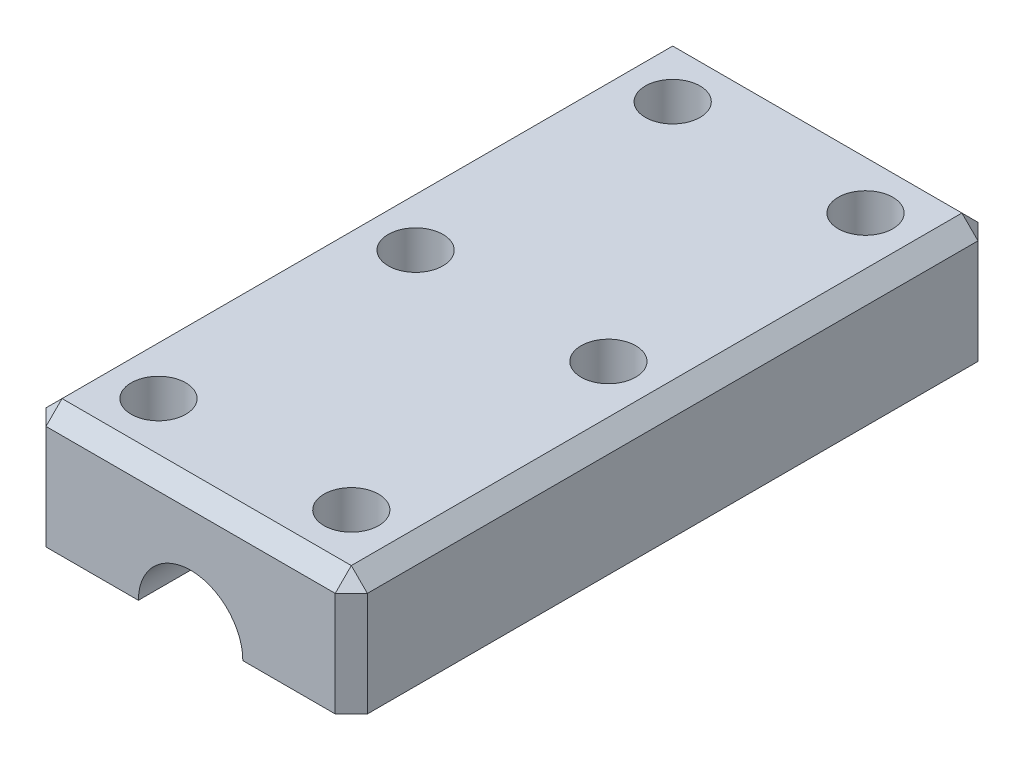
ISO-10303-21;
HEADER;
FILE_DESCRIPTION(('STEP AP214'),'2;1');
FILE_NAME('part.step','',(''),(''),'','','');
FILE_SCHEMA(('AUTOMOTIVE_DESIGN { 1 0 10303 214 1 1 1 1 }'));
ENDSEC;
DATA;
#1=APPLICATION_CONTEXT('core data for automotive mechanical design processes');
#2=APPLICATION_PROTOCOL_DEFINITION('international standard','automotive_design',2000,#1);
#3=PRODUCT_CONTEXT('',#1,'mechanical');
#4=PRODUCT('Part','Part','',(#3));
#5=PRODUCT_RELATED_PRODUCT_CATEGORY('part','',(#4));
#6=PRODUCT_DEFINITION_FORMATION('','',#4);
#7=PRODUCT_DEFINITION_CONTEXT('part definition',#1,'design');
#8=PRODUCT_DEFINITION('design','',#6,#7);
#9=PRODUCT_DEFINITION_SHAPE('','',#8);
#10=(LENGTH_UNIT() NAMED_UNIT(*) SI_UNIT(.MILLI.,.METRE.));
#11=(NAMED_UNIT(*) PLANE_ANGLE_UNIT() SI_UNIT($,.RADIAN.));
#12=(NAMED_UNIT(*) SI_UNIT($,.STERADIAN.) SOLID_ANGLE_UNIT());
#13=UNCERTAINTY_MEASURE_WITH_UNIT(LENGTH_MEASURE(1.E-05),#10,'distance_accuracy_value','');
#14=(GEOMETRIC_REPRESENTATION_CONTEXT(3) GLOBAL_UNCERTAINTY_ASSIGNED_CONTEXT((#13)) GLOBAL_UNIT_ASSIGNED_CONTEXT((#10,
#11,#12)) REPRESENTATION_CONTEXT('',''));
#15=CARTESIAN_POINT('',(0.,0.,0.));
#16=DIRECTION('',(0.,0.,1.));
#17=DIRECTION('',(1.,0.,0.));
#18=AXIS2_PLACEMENT_3D('',#15,#16,#17);
#19=CARTESIAN_POINT('',(0.,0.,0.));
#20=DIRECTION('',(0.,1.,0.));
#21=DIRECTION('',(0.,0.,1.));
#22=AXIS2_PLACEMENT_3D('',#19,#20,#21);
#23=PLANE('',#22);
#24=CARTESIAN_POINT('',(6.,0.,20.));
#25=DIRECTION('',(0.,1.,0.));
#26=DIRECTION('',(0.,0.,1.));
#27=AXIS2_PLACEMENT_3D('',#24,#25,#26);
#28=CIRCLE('',#27,1.7);
#29=CARTESIAN_POINT('',(6.,0.,21.7));
#30=VERTEX_POINT('',#29);
#31=EDGE_CURVE('E260',#30,#30,#28,.F.);
#32=ORIENTED_EDGE('',*,*,#31,.F.);
#33=EDGE_LOOP('',(#32));
#34=FACE_BOUND('',#33,.T.);
#35=DIRECTION('',(0.,0.,-1.));
#36=VECTOR('',#35,1.);
#37=CARTESIAN_POINT('',(3.25,0.,40.));
#38=LINE('',#37,#36);
#39=CARTESIAN_POINT('',(3.25,0.,40.));
#40=VERTEX_POINT('',#39);
#41=CARTESIAN_POINT('',(3.25,0.,0.));
#42=VERTEX_POINT('',#41);
#43=EDGE_CURVE('E238',#40,#42,#38,.T.);
#44=ORIENTED_EDGE('',*,*,#43,.T.);
#45=DIRECTION('',(1.,0.,0.));
#46=VECTOR('',#45,1.);
#47=CARTESIAN_POINT('',(0.,0.,0.));
#48=LINE('',#47,#46);
#49=CARTESIAN_POINT('',(9.,0.,0.));
#50=VERTEX_POINT('',#49);
#51=EDGE_CURVE('E235',#42,#50,#48,.T.);
#52=ORIENTED_EDGE('',*,*,#51,.T.);
#53=DIRECTION('',(0.707106781186548,0.,0.707106781186548));
#54=VECTOR('',#53,1.);
#55=CARTESIAN_POINT('',(10.,0.,0.999999999999994));
#56=LINE('',#55,#54);
#57=CARTESIAN_POINT('',(10.,0.,0.999999999999994));
#58=VERTEX_POINT('',#57);
#59=EDGE_CURVE('E240',#50,#58,#56,.T.);
#60=ORIENTED_EDGE('',*,*,#59,.T.);
#61=DIRECTION('',(0.,0.,-1.));
#62=VECTOR('',#61,1.);
#63=CARTESIAN_POINT('',(10.,0.,40.));
#64=LINE('',#63,#62);
#65=CARTESIAN_POINT('',(10.,0.,39.));
#66=VERTEX_POINT('',#65);
#67=EDGE_CURVE('E247',#66,#58,#64,.T.);
#68=ORIENTED_EDGE('',*,*,#67,.F.);
#69=DIRECTION('',(0.707106781186548,0.,-0.707106781186548));
#70=VECTOR('',#69,1.);
#71=CARTESIAN_POINT('',(9.,0.,40.));
#72=LINE('',#71,#70);
#73=CARTESIAN_POINT('',(9.,0.,40.));
#74=VERTEX_POINT('',#73);
#75=EDGE_CURVE('E244',#66,#74,#72,.F.);
#76=ORIENTED_EDGE('',*,*,#75,.T.);
#77=DIRECTION('',(1.,0.,0.));
#78=VECTOR('',#77,1.);
#79=CARTESIAN_POINT('',(0.,0.,40.));
#80=LINE('',#79,#78);
#81=EDGE_CURVE('E234',#40,#74,#80,.T.);
#82=ORIENTED_EDGE('',*,*,#81,.F.);
#83=EDGE_LOOP('',(#44,#52,#60,#68,#76,#82));
#84=FACE_BOUND('',#83,.T.);
#85=CARTESIAN_POINT('',(6.,0.,4.));
#86=DIRECTION('',(0.,1.,0.));
#87=DIRECTION('',(0.,0.,1.));
#88=AXIS2_PLACEMENT_3D('',#85,#86,#87);
#89=CIRCLE('',#88,1.7);
#90=CARTESIAN_POINT('',(6.,0.,5.7));
#91=VERTEX_POINT('',#90);
#92=EDGE_CURVE('E207',#91,#91,#89,.F.);
#93=ORIENTED_EDGE('',*,*,#92,.F.);
#94=EDGE_LOOP('',(#93));
#95=FACE_BOUND('',#94,.T.);
#96=CARTESIAN_POINT('',(6.,0.,36.));
#97=DIRECTION('',(0.,1.,0.));
#98=DIRECTION('',(0.,0.,1.));
#99=AXIS2_PLACEMENT_3D('',#96,#97,#98);
#100=CIRCLE('',#99,1.7);
#101=CARTESIAN_POINT('',(6.,0.,37.7));
#102=VERTEX_POINT('',#101);
#103=EDGE_CURVE('E265',#102,#102,#100,.F.);
#104=ORIENTED_EDGE('',*,*,#103,.F.);
#105=EDGE_LOOP('',(#104));
#106=FACE_BOUND('',#105,.T.);
#107=ADVANCED_FACE('F45',(#34,#84,#95,#106),#23,.F.);
#108=CARTESIAN_POINT('',(-6.,0.,20.));
#109=DIRECTION('',(0.,1.,0.));
#110=DIRECTION('',(0.,0.,1.));
#111=AXIS2_PLACEMENT_3D('',#108,#109,#110);
#112=CIRCLE('',#111,1.7);
#113=CARTESIAN_POINT('',(-6.,0.,21.7));
#114=VERTEX_POINT('',#113);
#115=EDGE_CURVE('E263',#114,#114,#112,.F.);
#116=ORIENTED_EDGE('',*,*,#115,.F.);
#117=EDGE_LOOP('',(#116));
#118=FACE_BOUND('',#117,.T.);
#119=DIRECTION('',(0.707106781186548,0.,0.707106781186548));
#120=VECTOR('',#119,1.);
#121=CARTESIAN_POINT('',(-9.00000000000001,0.,40.));
#122=LINE('',#121,#120);
#123=CARTESIAN_POINT('',(-9.00000000000001,0.,40.));
#124=VERTEX_POINT('',#123);
#125=CARTESIAN_POINT('',(-10.,0.,39.));
#126=VERTEX_POINT('',#125);
#127=EDGE_CURVE('E54',#124,#126,#122,.F.);
#128=ORIENTED_EDGE('',*,*,#127,.T.);
#129=DIRECTION('',(0.,0.,1.));
#130=VECTOR('',#129,1.);
#131=CARTESIAN_POINT('',(-10.,0.,40.));
#132=LINE('',#131,#130);
#133=CARTESIAN_POINT('',(-10.,0.,0.999999999999994));
#134=VERTEX_POINT('',#133);
#135=EDGE_CURVE('E142',#134,#126,#132,.T.);
#136=ORIENTED_EDGE('',*,*,#135,.F.);
#137=DIRECTION('',(0.707106781186548,0.,-0.707106781186548));
#138=VECTOR('',#137,1.);
#139=CARTESIAN_POINT('',(-10.,0.,0.999999999999994));
#140=LINE('',#139,#138);
#141=CARTESIAN_POINT('',(-9.00000000000001,0.,0.));
#142=VERTEX_POINT('',#141);
#143=EDGE_CURVE('E11',#134,#142,#140,.T.);
#144=ORIENTED_EDGE('',*,*,#143,.T.);
#145=CARTESIAN_POINT('',(-3.25,0.,0.));
#146=VERTEX_POINT('',#145);
#147=EDGE_CURVE('E62',#142,#146,#48,.T.);
#148=ORIENTED_EDGE('',*,*,#147,.T.);
#149=DIRECTION('',(0.,0.,-1.));
#150=VECTOR('',#149,1.);
#151=CARTESIAN_POINT('',(-3.25,0.,40.));
#152=LINE('',#151,#150);
#153=CARTESIAN_POINT('',(-3.25,0.,40.));
#154=VERTEX_POINT('',#153);
#155=EDGE_CURVE('E241',#146,#154,#152,.F.);
#156=ORIENTED_EDGE('',*,*,#155,.T.);
#157=EDGE_CURVE('E245',#124,#154,#80,.T.);
#158=ORIENTED_EDGE('',*,*,#157,.F.);
#159=EDGE_LOOP('',(#128,#136,#144,#148,#156,#158));
#160=FACE_BOUND('',#159,.T.);
#161=CARTESIAN_POINT('',(-6.,0.,4.));
#162=DIRECTION('',(0.,1.,0.));
#163=DIRECTION('',(0.,0.,1.));
#164=AXIS2_PLACEMENT_3D('',#161,#162,#163);
#165=CIRCLE('',#164,1.7);
#166=CARTESIAN_POINT('',(-6.,0.,5.7));
#167=VERTEX_POINT('',#166);
#168=EDGE_CURVE('E257',#167,#167,#165,.F.);
#169=ORIENTED_EDGE('',*,*,#168,.F.);
#170=EDGE_LOOP('',(#169));
#171=FACE_BOUND('',#170,.T.);
#172=CARTESIAN_POINT('',(-6.,0.,36.));
#173=DIRECTION('',(0.,1.,0.));
#174=DIRECTION('',(0.,0.,1.));
#175=AXIS2_PLACEMENT_3D('',#172,#173,#174);
#176=CIRCLE('',#175,1.7);
#177=CARTESIAN_POINT('',(-6.,0.,37.7));
#178=VERTEX_POINT('',#177);
#179=EDGE_CURVE('E49',#178,#178,#176,.F.);
#180=ORIENTED_EDGE('',*,*,#179,.F.);
#181=EDGE_LOOP('',(#180));
#182=FACE_BOUND('',#181,.T.);
#183=ADVANCED_FACE('F47',(#118,#160,#171,#182),#23,.F.);
#184=CARTESIAN_POINT('',(10.,-7.5,40.));
#185=DIRECTION('',(-1.,0.,0.));
#186=DIRECTION('',(0.,0.,1.));
#187=AXIS2_PLACEMENT_3D('',#184,#185,#186);
#188=PLANE('',#187);
#189=DIRECTION('',(0.,-1.,0.));
#190=VECTOR('',#189,1.);
#191=CARTESIAN_POINT('',(10.,-7.5,39.));
#192=LINE('',#191,#190);
#193=CARTESIAN_POINT('',(10.,6.50000000000001,39.));
#194=VERTEX_POINT('',#193);
#195=EDGE_CURVE('E188',#194,#66,#192,.T.);
#196=ORIENTED_EDGE('',*,*,#195,.T.);
#197=ORIENTED_EDGE('',*,*,#67,.T.);
#198=DIRECTION('',(0.,1.,0.));
#199=VECTOR('',#198,1.);
#200=CARTESIAN_POINT('',(10.,7.5,0.999999999999994));
#201=LINE('',#200,#199);
#202=CARTESIAN_POINT('',(10.,6.50000000000001,0.999999999999994));
#203=VERTEX_POINT('',#202);
#204=EDGE_CURVE('E191',#58,#203,#201,.T.);
#205=ORIENTED_EDGE('',*,*,#204,.T.);
#206=DIRECTION('',(0.,0.,1.));
#207=VECTOR('',#206,1.);
#208=CARTESIAN_POINT('',(10.,6.50000000000001,40.));
#209=LINE('',#208,#207);
#210=EDGE_CURVE('E186',#203,#194,#209,.T.);
#211=ORIENTED_EDGE('',*,*,#210,.T.);
#212=EDGE_LOOP('',(#196,#197,#205,#211));
#213=FACE_BOUND('',#212,.T.);
#214=ADVANCED_FACE('F276',(#213),#188,.F.);
#215=CARTESIAN_POINT('',(0.,0.,40.));
#216=DIRECTION('',(0.,0.,-1.));
#217=DIRECTION('',(-1.,0.,0.));
#218=AXIS2_PLACEMENT_3D('',#215,#216,#217);
#219=PLANE('',#218);
#220=DIRECTION('',(0.,-1.,0.));
#221=VECTOR('',#220,1.);
#222=CARTESIAN_POINT('',(-9.00000000000001,0.,40.));
#223=LINE('',#222,#221);
#224=CARTESIAN_POINT('',(-9.00000000000001,6.5,40.));
#225=VERTEX_POINT('',#224);
#226=EDGE_CURVE('E154',#225,#124,#223,.T.);
#227=ORIENTED_EDGE('',*,*,#226,.T.);
#228=ORIENTED_EDGE('',*,*,#157,.T.);
#229=CARTESIAN_POINT('',(0.,0.,40.));
#230=DIRECTION('',(0.,0.,1.));
#231=DIRECTION('',(1.,0.,0.));
#232=AXIS2_PLACEMENT_3D('',#229,#230,#231);
#233=CIRCLE('',#232,3.25);
#234=EDGE_CURVE('E171',#40,#154,#233,.T.);
#235=ORIENTED_EDGE('',*,*,#234,.F.);
#236=ORIENTED_EDGE('',*,*,#81,.T.);
#237=DIRECTION('',(0.,1.,0.));
#238=VECTOR('',#237,1.);
#239=CARTESIAN_POINT('',(9.,0.,40.));
#240=LINE('',#239,#238);
#241=CARTESIAN_POINT('',(9.,6.5,40.));
#242=VERTEX_POINT('',#241);
#243=EDGE_CURVE('E195',#74,#242,#240,.T.);
#244=ORIENTED_EDGE('',*,*,#243,.T.);
#245=DIRECTION('',(-1.,0.,0.));
#246=VECTOR('',#245,1.);
#247=CARTESIAN_POINT('',(0.,6.5,40.));
#248=LINE('',#247,#246);
#249=EDGE_CURVE('E193',#242,#225,#248,.T.);
#250=ORIENTED_EDGE('',*,*,#249,.T.);
#251=EDGE_LOOP('',(#227,#228,#235,#236,#244,#250));
#252=FACE_BOUND('',#251,.T.);
#253=ADVANCED_FACE('F283',(#252),#219,.F.);
#254=CARTESIAN_POINT('',(0.,0.,0.));
#255=DIRECTION('',(0.,0.,-1.));
#256=DIRECTION('',(-1.,0.,0.));
#257=AXIS2_PLACEMENT_3D('',#254,#255,#256);
#258=PLANE('',#257);
#259=ORIENTED_EDGE('',*,*,#147,.F.);
#260=DIRECTION('',(0.,1.,0.));
#261=VECTOR('',#260,1.);
#262=CARTESIAN_POINT('',(-9.00000000000001,7.5,0.));
#263=LINE('',#262,#261);
#264=CARTESIAN_POINT('',(-9.00000000000001,6.5,0.));
#265=VERTEX_POINT('',#264);
#266=EDGE_CURVE('E184',#142,#265,#263,.T.);
#267=ORIENTED_EDGE('',*,*,#266,.T.);
#268=DIRECTION('',(1.,0.,0.));
#269=VECTOR('',#268,1.);
#270=CARTESIAN_POINT('',(10.,6.5,0.));
#271=LINE('',#270,#269);
#272=CARTESIAN_POINT('',(9.,6.5,0.));
#273=VERTEX_POINT('',#272);
#274=EDGE_CURVE('E179',#265,#273,#271,.T.);
#275=ORIENTED_EDGE('',*,*,#274,.T.);
#276=DIRECTION('',(0.,-1.,0.));
#277=VECTOR('',#276,1.);
#278=CARTESIAN_POINT('',(9.,-2.5,0.));
#279=LINE('',#278,#277);
#280=EDGE_CURVE('E181',#273,#50,#279,.T.);
#281=ORIENTED_EDGE('',*,*,#280,.T.);
#282=ORIENTED_EDGE('',*,*,#51,.F.);
#283=CARTESIAN_POINT('',(0.,0.,0.));
#284=DIRECTION('',(0.,0.,1.));
#285=DIRECTION('',(1.,0.,0.));
#286=AXIS2_PLACEMENT_3D('',#283,#284,#285);
#287=CIRCLE('',#286,3.25);
#288=EDGE_CURVE('E174',#42,#146,#287,.T.);
#289=ORIENTED_EDGE('',*,*,#288,.T.);
#290=EDGE_LOOP('',(#259,#267,#275,#281,#282,#289));
#291=FACE_BOUND('',#290,.T.);
#292=ADVANCED_FACE('F419',(#291),#258,.T.);
#293=CARTESIAN_POINT('',(-10.,7.5,40.));
#294=DIRECTION('',(0.,-1.,0.));
#295=DIRECTION('',(0.,0.,-1.));
#296=AXIS2_PLACEMENT_3D('',#293,#294,#295);
#297=PLANE('',#296);
#298=DIRECTION('',(0.,0.,-1.));
#299=VECTOR('',#298,1.);
#300=CARTESIAN_POINT('',(9.,7.5,40.));
#301=LINE('',#300,#299);
#302=CARTESIAN_POINT('',(9.,7.5,39.));
#303=VERTEX_POINT('',#302);
#304=CARTESIAN_POINT('',(9.,7.5,0.999999999999994));
#305=VERTEX_POINT('',#304);
#306=EDGE_CURVE('E198',#303,#305,#301,.T.);
#307=ORIENTED_EDGE('',*,*,#306,.T.);
#308=DIRECTION('',(-1.,0.,0.));
#309=VECTOR('',#308,1.);
#310=CARTESIAN_POINT('',(-10.,7.5,0.999999999999994));
#311=LINE('',#310,#309);
#312=CARTESIAN_POINT('',(-9.00000000000001,7.5,0.999999999999994));
#313=VERTEX_POINT('',#312);
#314=EDGE_CURVE('E204',#305,#313,#311,.T.);
#315=ORIENTED_EDGE('',*,*,#314,.T.);
#316=DIRECTION('',(0.,0.,1.));
#317=VECTOR('',#316,1.);
#318=CARTESIAN_POINT('',(-9.00000000000001,7.5,40.));
#319=LINE('',#318,#317);
#320=CARTESIAN_POINT('',(-9.00000000000001,7.5,39.));
#321=VERTEX_POINT('',#320);
#322=EDGE_CURVE('E202',#313,#321,#319,.T.);
#323=ORIENTED_EDGE('',*,*,#322,.T.);
#324=DIRECTION('',(1.,0.,0.));
#325=VECTOR('',#324,1.);
#326=CARTESIAN_POINT('',(-10.,7.5,39.));
#327=LINE('',#326,#325);
#328=EDGE_CURVE('E200',#321,#303,#327,.T.);
#329=ORIENTED_EDGE('',*,*,#328,.T.);
#330=EDGE_LOOP('',(#307,#315,#323,#329));
#331=FACE_BOUND('',#330,.T.);
#332=CARTESIAN_POINT('',(6.,7.5,4.));
#333=DIRECTION('',(0.,1.,0.));
#334=DIRECTION('',(0.,0.,1.));
#335=AXIS2_PLACEMENT_3D('',#332,#333,#334);
#336=CIRCLE('',#335,1.7);
#337=CARTESIAN_POINT('',(6.,7.5,5.7));
#338=VERTEX_POINT('',#337);
#339=EDGE_CURVE('E231',#338,#338,#336,.T.);
#340=ORIENTED_EDGE('',*,*,#339,.F.);
#341=EDGE_LOOP('',(#340));
#342=FACE_BOUND('',#341,.T.);
#343=CARTESIAN_POINT('',(-6.,7.5,4.));
#344=DIRECTION('',(0.,1.,0.));
#345=DIRECTION('',(0.,0.,1.));
#346=AXIS2_PLACEMENT_3D('',#343,#344,#345);
#347=CIRCLE('',#346,1.7);
#348=CARTESIAN_POINT('',(-6.,7.5,5.7));
#349=VERTEX_POINT('',#348);
#350=EDGE_CURVE('E409',#349,#349,#347,.T.);
#351=ORIENTED_EDGE('',*,*,#350,.F.);
#352=EDGE_LOOP('',(#351));
#353=FACE_BOUND('',#352,.T.);
#354=CARTESIAN_POINT('',(6.,7.5,20.));
#355=DIRECTION('',(0.,1.,0.));
#356=DIRECTION('',(0.,0.,1.));
#357=AXIS2_PLACEMENT_3D('',#354,#355,#356);
#358=CIRCLE('',#357,1.7);
#359=CARTESIAN_POINT('',(6.,7.5,21.7));
#360=VERTEX_POINT('',#359);
#361=EDGE_CURVE('E406',#360,#360,#358,.T.);
#362=ORIENTED_EDGE('',*,*,#361,.F.);
#363=EDGE_LOOP('',(#362));
#364=FACE_BOUND('',#363,.T.);
#365=CARTESIAN_POINT('',(-6.,7.5,20.));
#366=DIRECTION('',(0.,1.,0.));
#367=DIRECTION('',(0.,0.,1.));
#368=AXIS2_PLACEMENT_3D('',#365,#366,#367);
#369=CIRCLE('',#368,1.7);
#370=CARTESIAN_POINT('',(-6.,7.5,21.7));
#371=VERTEX_POINT('',#370);
#372=EDGE_CURVE('E401',#371,#371,#369,.T.);
#373=ORIENTED_EDGE('',*,*,#372,.F.);
#374=EDGE_LOOP('',(#373));
#375=FACE_BOUND('',#374,.T.);
#376=CARTESIAN_POINT('',(6.,7.5,36.));
#377=DIRECTION('',(0.,1.,0.));
#378=DIRECTION('',(0.,0.,1.));
#379=AXIS2_PLACEMENT_3D('',#376,#377,#378);
#380=CIRCLE('',#379,1.7);
#381=CARTESIAN_POINT('',(6.,7.5,37.7));
#382=VERTEX_POINT('',#381);
#383=EDGE_CURVE('E397',#382,#382,#380,.T.);
#384=ORIENTED_EDGE('',*,*,#383,.F.);
#385=EDGE_LOOP('',(#384));
#386=FACE_BOUND('',#385,.T.);
#387=CARTESIAN_POINT('',(-6.,7.5,36.));
#388=DIRECTION('',(0.,1.,0.));
#389=DIRECTION('',(0.,0.,1.));
#390=AXIS2_PLACEMENT_3D('',#387,#388,#389);
#391=CIRCLE('',#390,1.7);
#392=CARTESIAN_POINT('',(-6.,7.5,37.7));
#393=VERTEX_POINT('',#392);
#394=EDGE_CURVE('E395',#393,#393,#391,.T.);
#395=ORIENTED_EDGE('',*,*,#394,.F.);
#396=EDGE_LOOP('',(#395));
#397=FACE_BOUND('',#396,.T.);
#398=ADVANCED_FACE('F416',(#331,#342,#353,#364,#375,#386,#397),#297,.F.);
#399=CARTESIAN_POINT('',(-10.,-7.5,40.));
#400=DIRECTION('',(1.,0.,0.));
#401=DIRECTION('',(0.,0.,-1.));
#402=AXIS2_PLACEMENT_3D('',#399,#400,#401);
#403=PLANE('',#402);
#404=DIRECTION('',(0.,-1.,0.));
#405=VECTOR('',#404,1.);
#406=CARTESIAN_POINT('',(-10.,-2.5,0.999999999999994));
#407=LINE('',#406,#405);
#408=CARTESIAN_POINT('',(-10.,6.50000000000001,0.999999999999994));
#409=VERTEX_POINT('',#408);
#410=EDGE_CURVE('E146',#409,#134,#407,.T.);
#411=ORIENTED_EDGE('',*,*,#410,.T.);
#412=ORIENTED_EDGE('',*,*,#135,.T.);
#413=DIRECTION('',(0.,1.,0.));
#414=VECTOR('',#413,1.);
#415=CARTESIAN_POINT('',(-10.,-7.5,39.));
#416=LINE('',#415,#414);
#417=CARTESIAN_POINT('',(-10.,6.50000000000001,39.));
#418=VERTEX_POINT('',#417);
#419=EDGE_CURVE('E135',#126,#418,#416,.T.);
#420=ORIENTED_EDGE('',*,*,#419,.T.);
#421=DIRECTION('',(0.,0.,-1.));
#422=VECTOR('',#421,1.);
#423=CARTESIAN_POINT('',(-10.,6.50000000000001,40.));
#424=LINE('',#423,#422);
#425=EDGE_CURVE('E140',#418,#409,#424,.T.);
#426=ORIENTED_EDGE('',*,*,#425,.T.);
#427=EDGE_LOOP('',(#411,#412,#420,#426));
#428=FACE_BOUND('',#427,.T.);
#429=ADVANCED_FACE('F138',(#428),#403,.F.);
#430=CARTESIAN_POINT('',(0.,0.,40.));
#431=DIRECTION('',(0.,0.,-1.));
#432=DIRECTION('',(-1.,0.,0.));
#433=AXIS2_PLACEMENT_3D('',#430,#431,#432);
#434=CYLINDRICAL_SURFACE('',#433,3.25);
#435=ORIENTED_EDGE('',*,*,#43,.F.);
#436=ORIENTED_EDGE('',*,*,#234,.T.);
#437=ORIENTED_EDGE('',*,*,#155,.F.);
#438=ORIENTED_EDGE('',*,*,#288,.F.);
#439=EDGE_LOOP('',(#435,#436,#437,#438));
#440=FACE_BOUND('',#439,.T.);
#441=ADVANCED_FACE('F394',(#440),#434,.F.);
#442=CARTESIAN_POINT('',(-6.,7.5,36.));
#443=DIRECTION('',(0.,1.,0.));
#444=DIRECTION('',(0.,0.,1.));
#445=AXIS2_PLACEMENT_3D('',#442,#443,#444);
#446=CYLINDRICAL_SURFACE('',#445,1.7);
#447=ORIENTED_EDGE('',*,*,#179,.T.);
#448=EDGE_LOOP('',(#447));
#449=FACE_BOUND('',#448,.T.);
#450=ORIENTED_EDGE('',*,*,#394,.T.);
#451=EDGE_LOOP('',(#450));
#452=FACE_BOUND('',#451,.T.);
#453=ADVANCED_FACE('F272',(#449,#452),#446,.F.);
#454=CARTESIAN_POINT('',(6.,7.5,36.));
#455=DIRECTION('',(0.,1.,0.));
#456=DIRECTION('',(0.,0.,1.));
#457=AXIS2_PLACEMENT_3D('',#454,#455,#456);
#458=CYLINDRICAL_SURFACE('',#457,1.7);
#459=ORIENTED_EDGE('',*,*,#103,.T.);
#460=EDGE_LOOP('',(#459));
#461=FACE_BOUND('',#460,.T.);
#462=ORIENTED_EDGE('',*,*,#383,.T.);
#463=EDGE_LOOP('',(#462));
#464=FACE_BOUND('',#463,.T.);
#465=ADVANCED_FACE('F430',(#461,#464),#458,.F.);
#466=CARTESIAN_POINT('',(-6.,7.5,20.));
#467=DIRECTION('',(0.,1.,0.));
#468=DIRECTION('',(0.,0.,1.));
#469=AXIS2_PLACEMENT_3D('',#466,#467,#468);
#470=CYLINDRICAL_SURFACE('',#469,1.7);
#471=ORIENTED_EDGE('',*,*,#115,.T.);
#472=EDGE_LOOP('',(#471));
#473=FACE_BOUND('',#472,.T.);
#474=ORIENTED_EDGE('',*,*,#372,.T.);
#475=EDGE_LOOP('',(#474));
#476=FACE_BOUND('',#475,.T.);
#477=ADVANCED_FACE('F432',(#473,#476),#470,.F.);
#478=CARTESIAN_POINT('',(6.,7.5,20.));
#479=DIRECTION('',(0.,1.,0.));
#480=DIRECTION('',(0.,0.,1.));
#481=AXIS2_PLACEMENT_3D('',#478,#479,#480);
#482=CYLINDRICAL_SURFACE('',#481,1.7);
#483=ORIENTED_EDGE('',*,*,#31,.T.);
#484=EDGE_LOOP('',(#483));
#485=FACE_BOUND('',#484,.T.);
#486=ORIENTED_EDGE('',*,*,#361,.T.);
#487=EDGE_LOOP('',(#486));
#488=FACE_BOUND('',#487,.T.);
#489=ADVANCED_FACE('F438',(#485,#488),#482,.F.);
#490=CARTESIAN_POINT('',(-6.,7.5,4.));
#491=DIRECTION('',(0.,1.,0.));
#492=DIRECTION('',(0.,0.,1.));
#493=AXIS2_PLACEMENT_3D('',#490,#491,#492);
#494=CYLINDRICAL_SURFACE('',#493,1.7);
#495=ORIENTED_EDGE('',*,*,#168,.T.);
#496=EDGE_LOOP('',(#495));
#497=FACE_BOUND('',#496,.T.);
#498=ORIENTED_EDGE('',*,*,#350,.T.);
#499=EDGE_LOOP('',(#498));
#500=FACE_BOUND('',#499,.T.);
#501=ADVANCED_FACE('F371',(#497,#500),#494,.F.);
#502=CARTESIAN_POINT('',(6.,7.5,4.));
#503=DIRECTION('',(0.,1.,0.));
#504=DIRECTION('',(0.,0.,1.));
#505=AXIS2_PLACEMENT_3D('',#502,#503,#504);
#506=CYLINDRICAL_SURFACE('',#505,1.7);
#507=ORIENTED_EDGE('',*,*,#92,.T.);
#508=EDGE_LOOP('',(#507));
#509=FACE_BOUND('',#508,.T.);
#510=ORIENTED_EDGE('',*,*,#339,.T.);
#511=EDGE_LOOP('',(#510));
#512=FACE_BOUND('',#511,.T.);
#513=ADVANCED_FACE('F366',(#509,#512),#506,.F.);
#514=CARTESIAN_POINT('',(9.,0.,40.));
#515=DIRECTION('',(-0.707106781186547,0.,-0.707106781186547));
#516=DIRECTION('',(0.,1.,0.));
#517=AXIS2_PLACEMENT_3D('',#514,#515,#516);
#518=PLANE('',#517);
#519=ORIENTED_EDGE('',*,*,#75,.F.);
#520=ORIENTED_EDGE('',*,*,#195,.F.);
#521=DIRECTION('',(-0.707106781186548,0.,0.707106781186548));
#522=VECTOR('',#521,1.);
#523=CARTESIAN_POINT('',(9.,6.5,40.));
#524=LINE('',#523,#522);
#525=EDGE_CURVE('E229',#242,#194,#524,.F.);
#526=ORIENTED_EDGE('',*,*,#525,.F.);
#527=ORIENTED_EDGE('',*,*,#243,.F.);
#528=EDGE_LOOP('',(#519,#520,#526,#527));
#529=FACE_BOUND('',#528,.T.);
#530=ADVANCED_FACE('F361',(#529),#518,.F.);
#531=CARTESIAN_POINT('',(9.,6.5,40.));
#532=DIRECTION('',(0.577350269189625,0.577350269189626,0.577350269189626));
#533=DIRECTION('',(0.,-0.707106781186548,0.707106781186548));
#534=AXIS2_PLACEMENT_3D('',#531,#532,#533);
#535=PLANE('',#534);
#536=DIRECTION('',(0.,0.707106781186547,-0.707106781186547));
#537=VECTOR('',#536,1.);
#538=CARTESIAN_POINT('',(9.,6.5,40.));
#539=LINE('',#538,#537);
#540=EDGE_CURVE('E223',#242,#303,#539,.T.);
#541=ORIENTED_EDGE('',*,*,#540,.F.);
#542=ORIENTED_EDGE('',*,*,#525,.T.);
#543=DIRECTION('',(0.707106781186548,-0.707106781186547,0.));
#544=VECTOR('',#543,1.);
#545=CARTESIAN_POINT('',(9.5,7.,39.));
#546=LINE('',#545,#544);
#547=EDGE_CURVE('E226',#303,#194,#546,.T.);
#548=ORIENTED_EDGE('',*,*,#547,.F.);
#549=EDGE_LOOP('',(#541,#542,#548));
#550=FACE_BOUND('',#549,.T.);
#551=ADVANCED_FACE('F355',(#550),#535,.T.);
#552=CARTESIAN_POINT('',(10.,-7.5,0.999999999999994));
#553=DIRECTION('',(0.707106781186547,0.,-0.707106781186547));
#554=DIRECTION('',(0.,-1.,0.));
#555=AXIS2_PLACEMENT_3D('',#552,#553,#554);
#556=PLANE('',#555);
#557=ORIENTED_EDGE('',*,*,#59,.F.);
#558=ORIENTED_EDGE('',*,*,#280,.F.);
#559=DIRECTION('',(-0.707106781186548,0.,-0.707106781186548));
#560=VECTOR('',#559,1.);
#561=CARTESIAN_POINT('',(10.,6.50000000000001,0.999999999999994));
#562=LINE('',#561,#560);
#563=EDGE_CURVE('E220',#203,#273,#562,.T.);
#564=ORIENTED_EDGE('',*,*,#563,.F.);
#565=ORIENTED_EDGE('',*,*,#204,.F.);
#566=EDGE_LOOP('',(#557,#558,#564,#565));
#567=FACE_BOUND('',#566,.T.);
#568=ADVANCED_FACE('F348',(#567),#556,.T.);
#569=CARTESIAN_POINT('',(9.,7.5,40.));
#570=DIRECTION('',(-0.707106781186547,-0.707106781186548,0.));
#571=DIRECTION('',(0.,0.,-1.));
#572=AXIS2_PLACEMENT_3D('',#569,#570,#571);
#573=PLANE('',#572);
#574=ORIENTED_EDGE('',*,*,#547,.T.);
#575=ORIENTED_EDGE('',*,*,#210,.F.);
#576=DIRECTION('',(-0.707106781186548,0.707106781186547,0.));
#577=VECTOR('',#576,1.);
#578=CARTESIAN_POINT('',(10.,6.50000000000001,0.999999999999994));
#579=LINE('',#578,#577);
#580=EDGE_CURVE('E217',#305,#203,#579,.F.);
#581=ORIENTED_EDGE('',*,*,#580,.F.);
#582=ORIENTED_EDGE('',*,*,#306,.F.);
#583=EDGE_LOOP('',(#574,#575,#581,#582));
#584=FACE_BOUND('',#583,.T.);
#585=ADVANCED_FACE('F341',(#584),#573,.F.);
#586=CARTESIAN_POINT('',(0.,6.5,40.));
#587=DIRECTION('',(0.,-0.707106781186547,-0.707106781186547));
#588=DIRECTION('',(-1.,0.,0.));
#589=AXIS2_PLACEMENT_3D('',#586,#587,#588);
#590=PLANE('',#589);
#591=ORIENTED_EDGE('',*,*,#540,.T.);
#592=ORIENTED_EDGE('',*,*,#328,.F.);
#593=DIRECTION('',(0.,-0.707106781186547,0.707106781186547));
#594=VECTOR('',#593,1.);
#595=CARTESIAN_POINT('',(-9.00000000000001,7.,39.5));
#596=LINE('',#595,#594);
#597=EDGE_CURVE('E158',#225,#321,#596,.F.);
#598=ORIENTED_EDGE('',*,*,#597,.F.);
#599=ORIENTED_EDGE('',*,*,#249,.F.);
#600=EDGE_LOOP('',(#591,#592,#598,#599));
#601=FACE_BOUND('',#600,.T.);
#602=ADVANCED_FACE('F335',(#601),#590,.F.);
#603=CARTESIAN_POINT('',(-9.00000000000001,0.,40.));
#604=DIRECTION('',(0.707106781186547,0.,-0.707106781186547));
#605=DIRECTION('',(0.,-1.,0.));
#606=AXIS2_PLACEMENT_3D('',#603,#604,#605);
#607=PLANE('',#606);
#608=ORIENTED_EDGE('',*,*,#127,.F.);
#609=ORIENTED_EDGE('',*,*,#226,.F.);
#610=DIRECTION('',(-0.707106781186548,0.,-0.707106781186548));
#611=VECTOR('',#610,1.);
#612=CARTESIAN_POINT('',(-10.,6.50000000000001,39.));
#613=LINE('',#612,#611);
#614=EDGE_CURVE('E150',#418,#225,#613,.F.);
#615=ORIENTED_EDGE('',*,*,#614,.F.);
#616=ORIENTED_EDGE('',*,*,#419,.F.);
#617=EDGE_LOOP('',(#608,#609,#615,#616));
#618=FACE_BOUND('',#617,.T.);
#619=ADVANCED_FACE('F152',(#618),#607,.F.);
#620=CARTESIAN_POINT('',(10.,6.50000000000001,0.999999999999994));
#621=DIRECTION('',(0.577350269189625,0.577350269189626,-0.577350269189626));
#622=DIRECTION('',(0.,0.707106781186548,0.707106781186548));
#623=AXIS2_PLACEMENT_3D('',#620,#621,#622);
#624=PLANE('',#623);
#625=ORIENTED_EDGE('',*,*,#580,.T.);
#626=ORIENTED_EDGE('',*,*,#563,.T.);
#627=DIRECTION('',(0.,0.707106781186547,0.707106781186547));
#628=VECTOR('',#627,1.);
#629=CARTESIAN_POINT('',(9.,7.,0.499999999999997));
#630=LINE('',#629,#628);
#631=EDGE_CURVE('E159',#305,#273,#630,.F.);
#632=ORIENTED_EDGE('',*,*,#631,.F.);
#633=EDGE_LOOP('',(#625,#626,#632));
#634=FACE_BOUND('',#633,.T.);
#635=ADVANCED_FACE('F324',(#634),#624,.T.);
#636=CARTESIAN_POINT('',(-10.,6.50000000000001,39.));
#637=DIRECTION('',(-0.577350269189625,0.577350269189626,0.577350269189626));
#638=DIRECTION('',(0.,-0.707106781186548,0.707106781186548));
#639=AXIS2_PLACEMENT_3D('',#636,#637,#638);
#640=PLANE('',#639);
#641=ORIENTED_EDGE('',*,*,#614,.T.);
#642=ORIENTED_EDGE('',*,*,#597,.T.);
#643=DIRECTION('',(0.707106781186548,0.707106781186547,0.));
#644=VECTOR('',#643,1.);
#645=CARTESIAN_POINT('',(-10.,6.50000000000001,39.));
#646=LINE('',#645,#644);
#647=EDGE_CURVE('E162',#418,#321,#646,.T.);
#648=ORIENTED_EDGE('',*,*,#647,.F.);
#649=EDGE_LOOP('',(#641,#642,#648));
#650=FACE_BOUND('',#649,.T.);
#651=ADVANCED_FACE('F163',(#650),#640,.T.);
#652=CARTESIAN_POINT('',(-10.,7.5,0.999999999999994));
#653=DIRECTION('',(0.,0.707106781186547,-0.707106781186547));
#654=DIRECTION('',(1.,0.,0.));
#655=AXIS2_PLACEMENT_3D('',#652,#653,#654);
#656=PLANE('',#655);
#657=ORIENTED_EDGE('',*,*,#631,.T.);
#658=ORIENTED_EDGE('',*,*,#274,.F.);
#659=DIRECTION('',(0.,-0.707106781186547,-0.707106781186547));
#660=VECTOR('',#659,1.);
#661=CARTESIAN_POINT('',(-9.00000000000001,6.5,0.));
#662=LINE('',#661,#660);
#663=EDGE_CURVE('E166',#313,#265,#662,.T.);
#664=ORIENTED_EDGE('',*,*,#663,.F.);
#665=ORIENTED_EDGE('',*,*,#314,.F.);
#666=EDGE_LOOP('',(#657,#658,#664,#665));
#667=FACE_BOUND('',#666,.T.);
#668=ADVANCED_FACE('F312',(#667),#656,.T.);
#669=CARTESIAN_POINT('',(-10.,6.50000000000001,40.));
#670=DIRECTION('',(0.707106781186547,-0.707106781186548,0.));
#671=DIRECTION('',(0.,0.,-1.));
#672=AXIS2_PLACEMENT_3D('',#669,#670,#671);
#673=PLANE('',#672);
#674=ORIENTED_EDGE('',*,*,#647,.T.);
#675=ORIENTED_EDGE('',*,*,#322,.F.);
#676=DIRECTION('',(-0.707106781186548,-0.707106781186547,0.));
#677=VECTOR('',#676,1.);
#678=CARTESIAN_POINT('',(-9.50000000000001,7.,0.999999999999994));
#679=LINE('',#678,#677);
#680=EDGE_CURVE('E169',#409,#313,#679,.F.);
#681=ORIENTED_EDGE('',*,*,#680,.F.);
#682=ORIENTED_EDGE('',*,*,#425,.F.);
#683=EDGE_LOOP('',(#674,#675,#681,#682));
#684=FACE_BOUND('',#683,.T.);
#685=ADVANCED_FACE('F168',(#684),#673,.F.);
#686=CARTESIAN_POINT('',(-9.00000000000001,6.5,0.));
#687=DIRECTION('',(-0.577350269189625,0.577350269189626,-0.577350269189626));
#688=DIRECTION('',(0.,0.707106781186548,0.707106781186548));
#689=AXIS2_PLACEMENT_3D('',#686,#687,#688);
#690=PLANE('',#689);
#691=ORIENTED_EDGE('',*,*,#680,.T.);
#692=ORIENTED_EDGE('',*,*,#663,.T.);
#693=DIRECTION('',(-0.707106781186548,0.,0.707106781186548));
#694=VECTOR('',#693,1.);
#695=CARTESIAN_POINT('',(-9.00000000000001,6.5,0.));
#696=LINE('',#695,#694);
#697=EDGE_CURVE('E208',#409,#265,#696,.F.);
#698=ORIENTED_EDGE('',*,*,#697,.F.);
#699=EDGE_LOOP('',(#691,#692,#698));
#700=FACE_BOUND('',#699,.T.);
#701=ADVANCED_FACE('F290',(#700),#690,.T.);
#702=CARTESIAN_POINT('',(-10.,-7.5,0.999999999999994));
#703=DIRECTION('',(-0.707106781186547,0.,-0.707106781186547));
#704=DIRECTION('',(0.,1.,0.));
#705=AXIS2_PLACEMENT_3D('',#702,#703,#704);
#706=PLANE('',#705);
#707=ORIENTED_EDGE('',*,*,#143,.F.);
#708=ORIENTED_EDGE('',*,*,#410,.F.);
#709=ORIENTED_EDGE('',*,*,#697,.T.);
#710=ORIENTED_EDGE('',*,*,#266,.F.);
#711=EDGE_LOOP('',(#707,#708,#709,#710));
#712=FACE_BOUND('',#711,.T.);
#713=ADVANCED_FACE('F278',(#712),#706,.T.);
#714=CLOSED_SHELL('',(#107,#183,#214,#253,#292,#398,#429,#441,#453,#465,#477,#489,#501,#513,
#530,#551,#568,#585,#602,#619,#635,#651,#668,#685,#701,#713));
#715=MANIFOLD_SOLID_BREP('B2',#714);
#716=ADVANCED_BREP_SHAPE_REPRESENTATION('',(#18,#715),#14);
#717=SHAPE_DEFINITION_REPRESENTATION(#9,#716);
ENDSEC;
END-ISO-10303-21;
